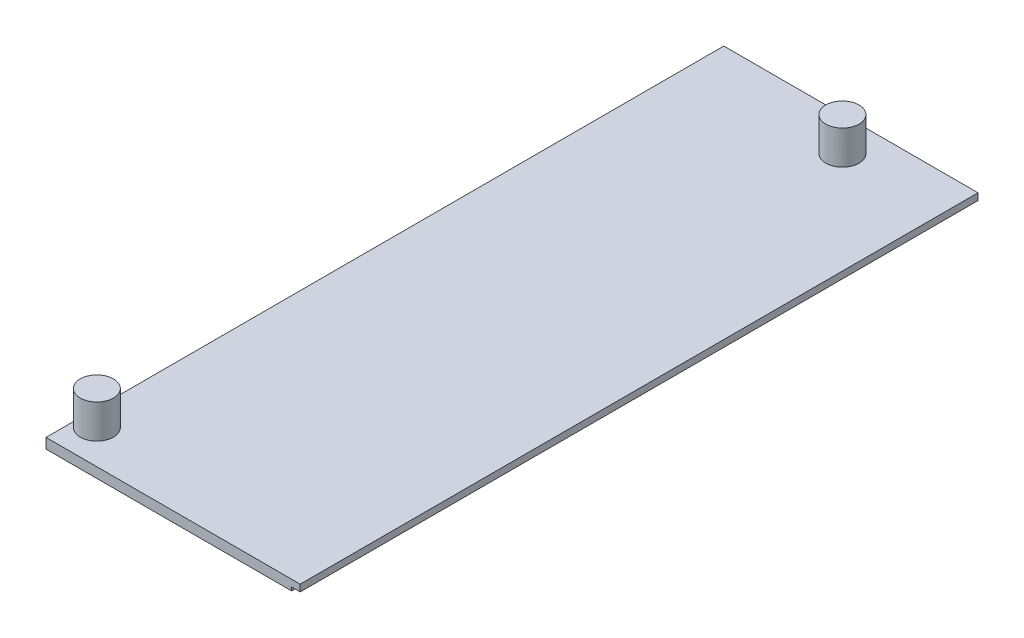
ISO-10303-21;
HEADER;
FILE_DESCRIPTION(('STEP AP214'),'2;1');
FILE_NAME('part.step','',(''),(''),'','','');
FILE_SCHEMA(('AUTOMOTIVE_DESIGN { 1 0 10303 214 1 1 1 1 }'));
ENDSEC;
DATA;
#1=APPLICATION_CONTEXT('core data for automotive mechanical design processes');
#2=APPLICATION_PROTOCOL_DEFINITION('international standard','automotive_design',2000,#1);
#3=PRODUCT_CONTEXT('',#1,'mechanical');
#4=PRODUCT('Part','Part','',(#3));
#5=PRODUCT_RELATED_PRODUCT_CATEGORY('part','',(#4));
#6=PRODUCT_DEFINITION_FORMATION('','',#4);
#7=PRODUCT_DEFINITION_CONTEXT('part definition',#1,'design');
#8=PRODUCT_DEFINITION('design','',#6,#7);
#9=PRODUCT_DEFINITION_SHAPE('','',#8);
#10=(LENGTH_UNIT() NAMED_UNIT(*) SI_UNIT(.MILLI.,.METRE.));
#11=(NAMED_UNIT(*) PLANE_ANGLE_UNIT() SI_UNIT($,.RADIAN.));
#12=(NAMED_UNIT(*) SI_UNIT($,.STERADIAN.) SOLID_ANGLE_UNIT());
#13=UNCERTAINTY_MEASURE_WITH_UNIT(LENGTH_MEASURE(1.E-05),#10,'distance_accuracy_value','');
#14=(GEOMETRIC_REPRESENTATION_CONTEXT(3) GLOBAL_UNCERTAINTY_ASSIGNED_CONTEXT((#13)) GLOBAL_UNIT_ASSIGNED_CONTEXT((#10,
#11,#12)) REPRESENTATION_CONTEXT('',''));
#15=CARTESIAN_POINT('',(0.,0.,0.));
#16=DIRECTION('',(0.,0.,1.));
#17=DIRECTION('',(1.,0.,0.));
#18=AXIS2_PLACEMENT_3D('',#15,#16,#17);
#19=CARTESIAN_POINT('',(0.,0.,200.));
#20=DIRECTION('',(1.,0.,0.));
#21=DIRECTION('',(0.,0.,-1.));
#22=AXIS2_PLACEMENT_3D('',#19,#20,#21);
#23=PLANE('',#22);
#24=DIRECTION('',(0.,-1.,0.));
#25=VECTOR('',#24,1.);
#26=CARTESIAN_POINT('',(0.,0.,0.));
#27=LINE('',#26,#25);
#28=CARTESIAN_POINT('',(0.,3.,0.));
#29=VERTEX_POINT('',#28);
#30=CARTESIAN_POINT('',(0.,0.,0.));
#31=VERTEX_POINT('',#30);
#32=EDGE_CURVE('E124',#29,#31,#27,.T.);
#33=ORIENTED_EDGE('',*,*,#32,.T.);
#34=DIRECTION('',(0.,0.,-1.));
#35=VECTOR('',#34,1.);
#36=CARTESIAN_POINT('',(0.,0.,200.));
#37=LINE('',#36,#35);
#38=CARTESIAN_POINT('',(0.,0.,200.));
#39=VERTEX_POINT('',#38);
#40=EDGE_CURVE('E136',#39,#31,#37,.T.);
#41=ORIENTED_EDGE('',*,*,#40,.F.);
#42=DIRECTION('',(0.,-1.,0.));
#43=VECTOR('',#42,1.);
#44=CARTESIAN_POINT('',(0.,0.,200.));
#45=LINE('',#44,#43);
#46=CARTESIAN_POINT('',(0.,3.,200.));
#47=VERTEX_POINT('',#46);
#48=EDGE_CURVE('E120',#47,#39,#45,.T.);
#49=ORIENTED_EDGE('',*,*,#48,.F.);
#50=DIRECTION('',(0.,0.,-1.));
#51=VECTOR('',#50,1.);
#52=CARTESIAN_POINT('',(0.,3.,200.));
#53=LINE('',#52,#51);
#54=EDGE_CURVE('E118',#47,#29,#53,.T.);
#55=ORIENTED_EDGE('',*,*,#54,.T.);
#56=EDGE_LOOP('',(#33,#41,#49,#55));
#57=FACE_BOUND('',#56,.T.);
#58=ADVANCED_FACE('F37',(#57),#23,.F.);
#59=CARTESIAN_POINT('',(0.,0.,200.));
#60=DIRECTION('',(0.,1.,0.));
#61=DIRECTION('',(0.,0.,1.));
#62=AXIS2_PLACEMENT_3D('',#59,#60,#61);
#63=PLANE('',#62);
#64=DIRECTION('',(1.,0.,0.));
#65=VECTOR('',#64,1.);
#66=CARTESIAN_POINT('',(0.,0.,0.));
#67=LINE('',#66,#65);
#68=CARTESIAN_POINT('',(72.5,0.,0.));
#69=VERTEX_POINT('',#68);
#70=EDGE_CURVE('E127',#31,#69,#67,.T.);
#71=ORIENTED_EDGE('',*,*,#70,.T.);
#72=DIRECTION('',(0.,0.,-1.));
#73=VECTOR('',#72,1.);
#74=CARTESIAN_POINT('',(72.5,0.,200.));
#75=LINE('',#74,#73);
#76=CARTESIAN_POINT('',(72.5,0.,200.));
#77=VERTEX_POINT('',#76);
#78=EDGE_CURVE('E108',#77,#69,#75,.T.);
#79=ORIENTED_EDGE('',*,*,#78,.F.);
#80=DIRECTION('',(1.,0.,0.));
#81=VECTOR('',#80,1.);
#82=CARTESIAN_POINT('',(0.,0.,200.));
#83=LINE('',#82,#81);
#84=EDGE_CURVE('E84',#39,#77,#83,.T.);
#85=ORIENTED_EDGE('',*,*,#84,.F.);
#86=ORIENTED_EDGE('',*,*,#40,.T.);
#87=EDGE_LOOP('',(#71,#79,#85,#86));
#88=FACE_BOUND('',#87,.T.);
#89=ADVANCED_FACE('F152',(#88),#63,.F.);
#90=CARTESIAN_POINT('',(75.,0.,200.));
#91=DIRECTION('',(-1.,0.,0.));
#92=DIRECTION('',(0.,0.,1.));
#93=AXIS2_PLACEMENT_3D('',#90,#91,#92);
#94=PLANE('',#93);
#95=DIRECTION('',(0.,1.,0.));
#96=VECTOR('',#95,1.);
#97=CARTESIAN_POINT('',(75.,0.,200.));
#98=LINE('',#97,#96);
#99=CARTESIAN_POINT('',(75.,1.,200.));
#100=VERTEX_POINT('',#99);
#101=CARTESIAN_POINT('',(75.,3.,200.));
#102=VERTEX_POINT('',#101);
#103=EDGE_CURVE('E111',#100,#102,#98,.T.);
#104=ORIENTED_EDGE('',*,*,#103,.F.);
#105=DIRECTION('',(0.,0.,1.));
#106=VECTOR('',#105,1.);
#107=CARTESIAN_POINT('',(75.,1.,200.));
#108=LINE('',#107,#106);
#109=CARTESIAN_POINT('',(75.,1.,0.));
#110=VERTEX_POINT('',#109);
#111=EDGE_CURVE('E98',#110,#100,#108,.T.);
#112=ORIENTED_EDGE('',*,*,#111,.F.);
#113=DIRECTION('',(0.,1.,0.));
#114=VECTOR('',#113,1.);
#115=CARTESIAN_POINT('',(75.,0.,0.));
#116=LINE('',#115,#114);
#117=CARTESIAN_POINT('',(75.,3.,0.));
#118=VERTEX_POINT('',#117);
#119=EDGE_CURVE('E131',#110,#118,#116,.T.);
#120=ORIENTED_EDGE('',*,*,#119,.T.);
#121=DIRECTION('',(0.,0.,-1.));
#122=VECTOR('',#121,1.);
#123=CARTESIAN_POINT('',(75.,3.,200.));
#124=LINE('',#123,#122);
#125=EDGE_CURVE('E116',#102,#118,#124,.T.);
#126=ORIENTED_EDGE('',*,*,#125,.F.);
#127=EDGE_LOOP('',(#104,#112,#120,#126));
#128=FACE_BOUND('',#127,.T.);
#129=ADVANCED_FACE('F115',(#128),#94,.F.);
#130=CARTESIAN_POINT('',(0.,3.,200.));
#131=DIRECTION('',(0.,-1.,0.));
#132=DIRECTION('',(0.,0.,-1.));
#133=AXIS2_PLACEMENT_3D('',#130,#131,#132);
#134=PLANE('',#133);
#135=CARTESIAN_POINT('',(5.00000000000002,3.,190.));
#136=DIRECTION('',(0.,-1.,0.));
#137=DIRECTION('',(0.,0.,-1.));
#138=AXIS2_PLACEMENT_3D('',#135,#136,#137);
#139=CIRCLE('',#138,4.89999999999997);
#140=CARTESIAN_POINT('',(5.00000000000002,3.,185.1));
#141=VERTEX_POINT('',#140);
#142=EDGE_CURVE('E11',#141,#141,#139,.F.);
#143=ORIENTED_EDGE('',*,*,#142,.F.);
#144=EDGE_LOOP('',(#143));
#145=FACE_BOUND('',#144,.T.);
#146=CARTESIAN_POINT('',(45.,3.,10.));
#147=DIRECTION('',(0.,-1.,0.));
#148=DIRECTION('',(0.,0.,-1.));
#149=AXIS2_PLACEMENT_3D('',#146,#147,#148);
#150=CIRCLE('',#149,4.9);
#151=CARTESIAN_POINT('',(45.,3.,5.10000000000001));
#152=VERTEX_POINT('',#151);
#153=EDGE_CURVE('E44',#152,#152,#150,.F.);
#154=ORIENTED_EDGE('',*,*,#153,.F.);
#155=EDGE_LOOP('',(#154));
#156=FACE_BOUND('',#155,.T.);
#157=DIRECTION('',(-1.,0.,0.));
#158=VECTOR('',#157,1.);
#159=CARTESIAN_POINT('',(0.,3.,0.));
#160=LINE('',#159,#158);
#161=EDGE_CURVE('E77',#118,#29,#160,.T.);
#162=ORIENTED_EDGE('',*,*,#161,.T.);
#163=ORIENTED_EDGE('',*,*,#54,.F.);
#164=DIRECTION('',(-1.,0.,0.));
#165=VECTOR('',#164,1.);
#166=CARTESIAN_POINT('',(0.,3.,200.));
#167=LINE('',#166,#165);
#168=EDGE_CURVE('E60',#102,#47,#167,.T.);
#169=ORIENTED_EDGE('',*,*,#168,.F.);
#170=ORIENTED_EDGE('',*,*,#125,.T.);
#171=EDGE_LOOP('',(#162,#163,#169,#170));
#172=FACE_BOUND('',#171,.T.);
#173=ADVANCED_FACE('F142',(#145,#156,#172),#134,.F.);
#174=CARTESIAN_POINT('',(0.,0.,200.));
#175=DIRECTION('',(0.,0.,-1.));
#176=DIRECTION('',(-1.,0.,0.));
#177=AXIS2_PLACEMENT_3D('',#174,#175,#176);
#178=PLANE('',#177);
#179=ORIENTED_EDGE('',*,*,#84,.T.);
#180=DIRECTION('',(0.,-1.,0.));
#181=VECTOR('',#180,1.);
#182=CARTESIAN_POINT('',(72.5,1.,200.));
#183=LINE('',#182,#181);
#184=CARTESIAN_POINT('',(72.5,1.,200.));
#185=VERTEX_POINT('',#184);
#186=EDGE_CURVE('E113',#185,#77,#183,.T.);
#187=ORIENTED_EDGE('',*,*,#186,.F.);
#188=DIRECTION('',(-1.,0.,0.));
#189=VECTOR('',#188,1.);
#190=CARTESIAN_POINT('',(75.,1.,200.));
#191=LINE('',#190,#189);
#192=EDGE_CURVE('E101',#100,#185,#191,.T.);
#193=ORIENTED_EDGE('',*,*,#192,.F.);
#194=ORIENTED_EDGE('',*,*,#103,.T.);
#195=ORIENTED_EDGE('',*,*,#168,.T.);
#196=ORIENTED_EDGE('',*,*,#48,.T.);
#197=EDGE_LOOP('',(#179,#187,#193,#194,#195,#196));
#198=FACE_BOUND('',#197,.T.);
#199=ADVANCED_FACE('F110',(#198),#178,.F.);
#200=CARTESIAN_POINT('',(0.,0.,0.));
#201=DIRECTION('',(0.,0.,-1.));
#202=DIRECTION('',(-1.,0.,0.));
#203=AXIS2_PLACEMENT_3D('',#200,#201,#202);
#204=PLANE('',#203);
#205=DIRECTION('',(0.,-1.,0.));
#206=VECTOR('',#205,1.);
#207=CARTESIAN_POINT('',(72.5,1.,0.));
#208=LINE('',#207,#206);
#209=CARTESIAN_POINT('',(72.5,1.,0.));
#210=VERTEX_POINT('',#209);
#211=EDGE_CURVE('E166',#210,#69,#208,.T.);
#212=ORIENTED_EDGE('',*,*,#211,.T.);
#213=ORIENTED_EDGE('',*,*,#70,.F.);
#214=ORIENTED_EDGE('',*,*,#32,.F.);
#215=ORIENTED_EDGE('',*,*,#161,.F.);
#216=ORIENTED_EDGE('',*,*,#119,.F.);
#217=DIRECTION('',(1.,0.,0.));
#218=VECTOR('',#217,1.);
#219=CARTESIAN_POINT('',(75.,1.,0.));
#220=LINE('',#219,#218);
#221=EDGE_CURVE('E104',#210,#110,#220,.T.);
#222=ORIENTED_EDGE('',*,*,#221,.F.);
#223=EDGE_LOOP('',(#212,#213,#214,#215,#216,#222));
#224=FACE_BOUND('',#223,.T.);
#225=ADVANCED_FACE('F150',(#224),#204,.T.);
#226=CARTESIAN_POINT('',(45.,13.,10.));
#227=DIRECTION('',(0.,-1.,0.));
#228=DIRECTION('',(0.,0.,-1.));
#229=AXIS2_PLACEMENT_3D('',#226,#227,#228);
#230=CYLINDRICAL_SURFACE('',#229,4.9);
#231=CARTESIAN_POINT('',(45.,13.,10.));
#232=DIRECTION('',(0.,1.,0.));
#233=DIRECTION('',(0.,0.,1.));
#234=AXIS2_PLACEMENT_3D('',#231,#232,#233);
#235=CIRCLE('',#234,4.9);
#236=CARTESIAN_POINT('',(45.,13.,14.9));
#237=VERTEX_POINT('',#236);
#238=EDGE_CURVE('E128',#237,#237,#235,.T.);
#239=ORIENTED_EDGE('',*,*,#238,.F.);
#240=EDGE_LOOP('',(#239));
#241=FACE_BOUND('',#240,.T.);
#242=ORIENTED_EDGE('',*,*,#153,.T.);
#243=EDGE_LOOP('',(#242));
#244=FACE_BOUND('',#243,.T.);
#245=ADVANCED_FACE('F140',(#241,#244),#230,.T.);
#246=CARTESIAN_POINT('',(0.,13.,0.));
#247=DIRECTION('',(0.,1.,0.));
#248=DIRECTION('',(0.,0.,1.));
#249=AXIS2_PLACEMENT_3D('',#246,#247,#248);
#250=PLANE('',#249);
#251=ORIENTED_EDGE('',*,*,#238,.T.);
#252=EDGE_LOOP('',(#251));
#253=FACE_BOUND('',#252,.T.);
#254=ADVANCED_FACE('F192',(#253),#250,.T.);
#255=CARTESIAN_POINT('',(5.00000000000002,13.,190.));
#256=DIRECTION('',(0.,-1.,0.));
#257=DIRECTION('',(0.,0.,-1.));
#258=AXIS2_PLACEMENT_3D('',#255,#256,#257);
#259=CYLINDRICAL_SURFACE('',#258,4.89999999999997);
#260=CARTESIAN_POINT('',(5.00000000000002,13.,190.));
#261=DIRECTION('',(0.,1.,0.));
#262=DIRECTION('',(0.,0.,1.));
#263=AXIS2_PLACEMENT_3D('',#260,#261,#262);
#264=CIRCLE('',#263,4.89999999999997);
#265=CARTESIAN_POINT('',(5.00000000000002,13.,194.9));
#266=VERTEX_POINT('',#265);
#267=EDGE_CURVE('E172',#266,#266,#264,.T.);
#268=ORIENTED_EDGE('',*,*,#267,.F.);
#269=EDGE_LOOP('',(#268));
#270=FACE_BOUND('',#269,.T.);
#271=ORIENTED_EDGE('',*,*,#142,.T.);
#272=EDGE_LOOP('',(#271));
#273=FACE_BOUND('',#272,.T.);
#274=ADVANCED_FACE('F187',(#270,#273),#259,.T.);
#275=CARTESIAN_POINT('',(5.00000000000002,13.,190.));
#276=DIRECTION('',(0.,1.,0.));
#277=DIRECTION('',(0.,0.,1.));
#278=AXIS2_PLACEMENT_3D('',#275,#276,#277);
#279=PLANE('',#278);
#280=ORIENTED_EDGE('',*,*,#267,.T.);
#281=EDGE_LOOP('',(#280));
#282=FACE_BOUND('',#281,.T.);
#283=ADVANCED_FACE('F180',(#282),#279,.T.);
#284=CARTESIAN_POINT('',(72.5,1.,200.));
#285=DIRECTION('',(-1.,0.,0.));
#286=DIRECTION('',(0.,0.,1.));
#287=AXIS2_PLACEMENT_3D('',#284,#285,#286);
#288=PLANE('',#287);
#289=ORIENTED_EDGE('',*,*,#78,.T.);
#290=ORIENTED_EDGE('',*,*,#211,.F.);
#291=DIRECTION('',(0.,0.,-1.));
#292=VECTOR('',#291,1.);
#293=CARTESIAN_POINT('',(72.5,1.,200.));
#294=LINE('',#293,#292);
#295=EDGE_CURVE('E51',#185,#210,#294,.T.);
#296=ORIENTED_EDGE('',*,*,#295,.F.);
#297=ORIENTED_EDGE('',*,*,#186,.T.);
#298=EDGE_LOOP('',(#289,#290,#296,#297));
#299=FACE_BOUND('',#298,.T.);
#300=ADVANCED_FACE('F178',(#299),#288,.F.);
#301=CARTESIAN_POINT('',(0.,1.,0.));
#302=DIRECTION('',(0.,1.,0.));
#303=DIRECTION('',(0.,0.,1.));
#304=AXIS2_PLACEMENT_3D('',#301,#302,#303);
#305=PLANE('',#304);
#306=ORIENTED_EDGE('',*,*,#111,.T.);
#307=ORIENTED_EDGE('',*,*,#192,.T.);
#308=ORIENTED_EDGE('',*,*,#295,.T.);
#309=ORIENTED_EDGE('',*,*,#221,.T.);
#310=EDGE_LOOP('',(#306,#307,#308,#309));
#311=FACE_BOUND('',#310,.T.);
#312=ADVANCED_FACE('F100',(#311),#305,.F.);
#313=CLOSED_SHELL('',(#58,#89,#129,#173,#199,#225,#245,#254,#274,#283,#300,#312));
#314=MANIFOLD_SOLID_BREP('B2',#313);
#315=ADVANCED_BREP_SHAPE_REPRESENTATION('',(#18,#314),#14);
#316=SHAPE_DEFINITION_REPRESENTATION(#9,#315);
ENDSEC;
END-ISO-10303-21;
